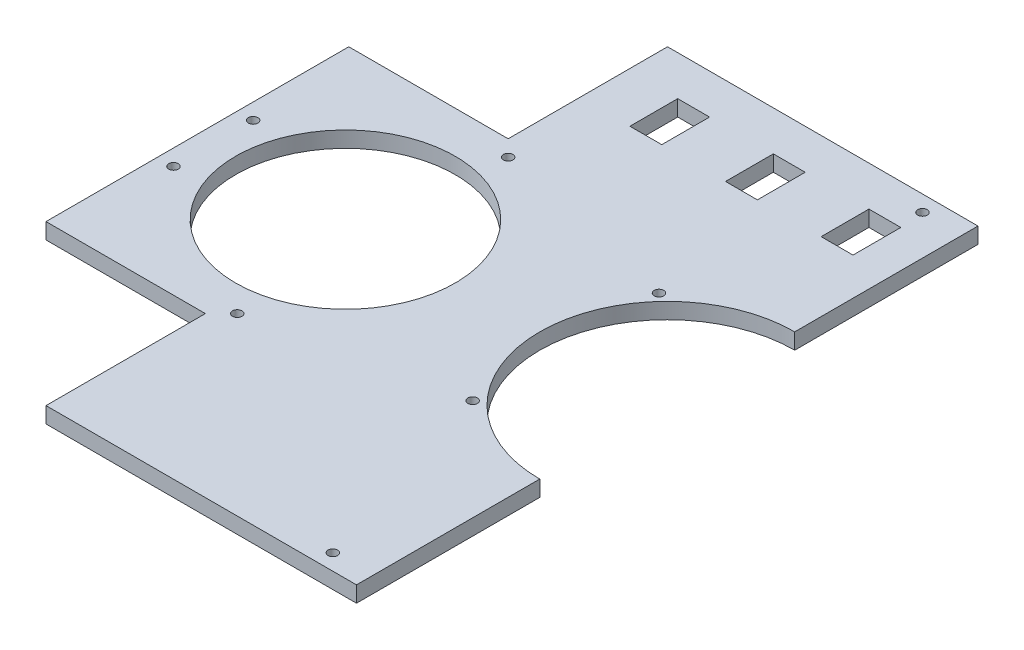
ISO-10303-21;
HEADER;
FILE_DESCRIPTION(('STEP AP214'),'2;1');
FILE_NAME('part.step','',(''),(''),'','','');
FILE_SCHEMA(('AUTOMOTIVE_DESIGN { 1 0 10303 214 1 1 1 1 }'));
ENDSEC;
DATA;
#1=APPLICATION_CONTEXT('core data for automotive mechanical design processes');
#2=APPLICATION_PROTOCOL_DEFINITION('international standard','automotive_design',2000,#1);
#3=PRODUCT_CONTEXT('',#1,'mechanical');
#4=PRODUCT('Part','Part','',(#3));
#5=PRODUCT_RELATED_PRODUCT_CATEGORY('part','',(#4));
#6=PRODUCT_DEFINITION_FORMATION('','',#4);
#7=PRODUCT_DEFINITION_CONTEXT('part definition',#1,'design');
#8=PRODUCT_DEFINITION('design','',#6,#7);
#9=PRODUCT_DEFINITION_SHAPE('','',#8);
#10=(LENGTH_UNIT() NAMED_UNIT(*) SI_UNIT(.MILLI.,.METRE.));
#11=(NAMED_UNIT(*) PLANE_ANGLE_UNIT() SI_UNIT($,.RADIAN.));
#12=(NAMED_UNIT(*) SI_UNIT($,.STERADIAN.) SOLID_ANGLE_UNIT());
#13=UNCERTAINTY_MEASURE_WITH_UNIT(LENGTH_MEASURE(1.E-05),#10,'distance_accuracy_value','');
#14=(GEOMETRIC_REPRESENTATION_CONTEXT(3) GLOBAL_UNCERTAINTY_ASSIGNED_CONTEXT((#13)) GLOBAL_UNIT_ASSIGNED_CONTEXT((#10,
#11,#12)) REPRESENTATION_CONTEXT('',''));
#15=CARTESIAN_POINT('',(0.,0.,0.));
#16=DIRECTION('',(0.,0.,1.));
#17=DIRECTION('',(1.,0.,0.));
#18=AXIS2_PLACEMENT_3D('',#15,#16,#17);
#19=CARTESIAN_POINT('',(0.,5.,0.00446078629536516));
#20=DIRECTION('',(0.,-1.,0.));
#21=DIRECTION('',(0.,0.,-1.));
#22=AXIS2_PLACEMENT_3D('',#19,#20,#21);
#23=CYLINDRICAL_SURFACE('',#22,40.);
#24=CARTESIAN_POINT('',(0.,0.,0.00446078629536516));
#25=DIRECTION('',(0.,1.,0.));
#26=DIRECTION('',(0.,0.,1.));
#27=AXIS2_PLACEMENT_3D('',#24,#25,#26);
#28=CIRCLE('',#27,40.);
#29=CARTESIAN_POINT('',(0.,0.,-39.9955392137046));
#30=VERTEX_POINT('',#29);
#31=CARTESIAN_POINT('',(0.,0.,40.0044607862954));
#32=VERTEX_POINT('',#31);
#33=EDGE_CURVE('E348',#30,#32,#28,.T.);
#34=ORIENTED_EDGE('',*,*,#33,.F.);
#35=DIRECTION('',(0.,-1.,0.));
#36=VECTOR('',#35,1.);
#37=CARTESIAN_POINT('',(0.,5.,-39.9955392137046));
#38=LINE('',#37,#36);
#39=CARTESIAN_POINT('',(0.,5.,-39.9955392137046));
#40=VERTEX_POINT('',#39);
#41=EDGE_CURVE('E11',#40,#30,#38,.T.);
#42=ORIENTED_EDGE('',*,*,#41,.F.);
#43=CARTESIAN_POINT('',(0.,5.,0.00446078629536516));
#44=DIRECTION('',(0.,1.,0.));
#45=DIRECTION('',(0.,0.,1.));
#46=AXIS2_PLACEMENT_3D('',#43,#44,#45);
#47=CIRCLE('',#46,40.);
#48=CARTESIAN_POINT('',(0.,5.,40.0044607862954));
#49=VERTEX_POINT('',#48);
#50=EDGE_CURVE('E293',#40,#49,#47,.T.);
#51=ORIENTED_EDGE('',*,*,#50,.T.);
#52=DIRECTION('',(0.,-1.,0.));
#53=VECTOR('',#52,1.);
#54=CARTESIAN_POINT('',(0.,5.,40.0044607862954));
#55=LINE('',#54,#53);
#56=EDGE_CURVE('E339',#49,#32,#55,.T.);
#57=ORIENTED_EDGE('',*,*,#56,.T.);
#58=EDGE_LOOP('',(#34,#42,#51,#57));
#59=FACE_BOUND('',#58,.T.);
#60=ADVANCED_FACE('F35',(#59),#23,.F.);
#61=CARTESIAN_POINT('',(0.,5.,0.));
#62=DIRECTION('',(1.,0.,0.));
#63=DIRECTION('',(0.,0.,-1.));
#64=AXIS2_PLACEMENT_3D('',#61,#62,#63);
#65=PLANE('',#64);
#66=DIRECTION('',(0.,0.,1.));
#67=VECTOR('',#66,1.);
#68=CARTESIAN_POINT('',(0.,0.,0.));
#69=LINE('',#68,#67);
#70=CARTESIAN_POINT('',(0.,0.,-97.4955392137046));
#71=VERTEX_POINT('',#70);
#72=EDGE_CURVE('E351',#71,#30,#69,.T.);
#73=ORIENTED_EDGE('',*,*,#72,.F.);
#74=DIRECTION('',(0.,-1.,0.));
#75=VECTOR('',#74,1.);
#76=CARTESIAN_POINT('',(0.,5.,-97.4955392137046));
#77=LINE('',#76,#75);
#78=CARTESIAN_POINT('',(0.,5.,-97.4955392137046));
#79=VERTEX_POINT('',#78);
#80=EDGE_CURVE('E43',#79,#71,#77,.T.);
#81=ORIENTED_EDGE('',*,*,#80,.F.);
#82=DIRECTION('',(0.,0.,1.));
#83=VECTOR('',#82,1.);
#84=CARTESIAN_POINT('',(0.,5.,0.));
#85=LINE('',#84,#83);
#86=EDGE_CURVE('E296',#79,#40,#85,.T.);
#87=ORIENTED_EDGE('',*,*,#86,.T.);
#88=ORIENTED_EDGE('',*,*,#41,.T.);
#89=EDGE_LOOP('',(#73,#81,#87,#88));
#90=FACE_BOUND('',#89,.T.);
#91=ADVANCED_FACE('F417',(#90),#65,.T.);
#92=CARTESIAN_POINT('',(0.,5.,-97.4955392137046));
#93=DIRECTION('',(0.,0.,-1.));
#94=DIRECTION('',(-1.,0.,0.));
#95=AXIS2_PLACEMENT_3D('',#92,#93,#94);
#96=PLANE('',#95);
#97=DIRECTION('',(1.,0.,0.));
#98=VECTOR('',#97,1.);
#99=CARTESIAN_POINT('',(0.,0.,-97.4955392137046));
#100=LINE('',#99,#98);
#101=CARTESIAN_POINT('',(-97.415,0.,-97.4955392137047));
#102=VERTEX_POINT('',#101);
#103=EDGE_CURVE('E354',#102,#71,#100,.T.);
#104=ORIENTED_EDGE('',*,*,#103,.F.);
#105=DIRECTION('',(0.,-1.,0.));
#106=VECTOR('',#105,1.);
#107=CARTESIAN_POINT('',(-97.415,5.,-97.4955392137047));
#108=LINE('',#107,#106);
#109=CARTESIAN_POINT('',(-97.415,5.,-97.4955392137047));
#110=VERTEX_POINT('',#109);
#111=EDGE_CURVE('E409',#110,#102,#108,.T.);
#112=ORIENTED_EDGE('',*,*,#111,.F.);
#113=DIRECTION('',(1.,0.,0.));
#114=VECTOR('',#113,1.);
#115=CARTESIAN_POINT('',(0.,5.,-97.4955392137046));
#116=LINE('',#115,#114);
#117=EDGE_CURVE('E299',#110,#79,#116,.T.);
#118=ORIENTED_EDGE('',*,*,#117,.T.);
#119=ORIENTED_EDGE('',*,*,#80,.T.);
#120=EDGE_LOOP('',(#104,#112,#118,#119));
#121=FACE_BOUND('',#120,.T.);
#122=ADVANCED_FACE('F413',(#121),#96,.T.);
#123=CARTESIAN_POINT('',(-97.4149999999999,5.,1.0815237594386E-13));
#124=DIRECTION('',(-1.,0.,0.));
#125=DIRECTION('',(0.,0.,1.));
#126=AXIS2_PLACEMENT_3D('',#123,#124,#125);
#127=PLANE('',#126);
#128=DIRECTION('',(0.,0.,-1.));
#129=VECTOR('',#128,1.);
#130=CARTESIAN_POINT('',(-97.4149999999999,0.,1.0815237594386E-13));
#131=LINE('',#130,#129);
#132=CARTESIAN_POINT('',(-97.415,0.,-47.4955392137047));
#133=VERTEX_POINT('',#132);
#134=EDGE_CURVE('E357',#133,#102,#131,.T.);
#135=ORIENTED_EDGE('',*,*,#134,.F.);
#136=DIRECTION('',(0.,-1.,0.));
#137=VECTOR('',#136,1.);
#138=CARTESIAN_POINT('',(-97.415,5.,-47.4955392137047));
#139=LINE('',#138,#137);
#140=CARTESIAN_POINT('',(-97.415,5.,-47.4955392137047));
#141=VERTEX_POINT('',#140);
#142=EDGE_CURVE('E407',#141,#133,#139,.T.);
#143=ORIENTED_EDGE('',*,*,#142,.F.);
#144=DIRECTION('',(0.,0.,-1.));
#145=VECTOR('',#144,1.);
#146=CARTESIAN_POINT('',(-97.4149999999999,5.,1.0815237594386E-13));
#147=LINE('',#146,#145);
#148=EDGE_CURVE('E302',#141,#110,#147,.T.);
#149=ORIENTED_EDGE('',*,*,#148,.T.);
#150=ORIENTED_EDGE('',*,*,#111,.T.);
#151=EDGE_LOOP('',(#135,#143,#149,#150));
#152=FACE_BOUND('',#151,.T.);
#153=ADVANCED_FACE('F424',(#152),#127,.T.);
#154=CARTESIAN_POINT('',(0.,5.,-47.4955392137047));
#155=DIRECTION('',(0.,0.,-1.));
#156=DIRECTION('',(-1.,0.,0.));
#157=AXIS2_PLACEMENT_3D('',#154,#155,#156);
#158=PLANE('',#157);
#159=DIRECTION('',(1.,0.,0.));
#160=VECTOR('',#159,1.);
#161=CARTESIAN_POINT('',(0.,0.,-47.4955392137047));
#162=LINE('',#161,#160);
#163=CARTESIAN_POINT('',(-147.415,0.,-47.4955392137047));
#164=VERTEX_POINT('',#163);
#165=EDGE_CURVE('E360',#164,#133,#162,.T.);
#166=ORIENTED_EDGE('',*,*,#165,.F.);
#167=DIRECTION('',(0.,-1.,0.));
#168=VECTOR('',#167,1.);
#169=CARTESIAN_POINT('',(-147.415,5.,-47.4955392137047));
#170=LINE('',#169,#168);
#171=CARTESIAN_POINT('',(-147.415,5.,-47.4955392137047));
#172=VERTEX_POINT('',#171);
#173=EDGE_CURVE('E405',#172,#164,#170,.T.);
#174=ORIENTED_EDGE('',*,*,#173,.F.);
#175=DIRECTION('',(1.,0.,0.));
#176=VECTOR('',#175,1.);
#177=CARTESIAN_POINT('',(0.,5.,-47.4955392137047));
#178=LINE('',#177,#176);
#179=EDGE_CURVE('E305',#172,#141,#178,.T.);
#180=ORIENTED_EDGE('',*,*,#179,.T.);
#181=ORIENTED_EDGE('',*,*,#142,.T.);
#182=EDGE_LOOP('',(#166,#174,#180,#181));
#183=FACE_BOUND('',#182,.T.);
#184=ADVANCED_FACE('F452',(#183),#158,.T.);
#185=CARTESIAN_POINT('',(-147.415,5.,0.));
#186=DIRECTION('',(-1.,0.,0.));
#187=DIRECTION('',(0.,0.,1.));
#188=AXIS2_PLACEMENT_3D('',#185,#186,#187);
#189=PLANE('',#188);
#190=DIRECTION('',(0.,0.,-1.));
#191=VECTOR('',#190,1.);
#192=CARTESIAN_POINT('',(-147.415,0.,0.));
#193=LINE('',#192,#191);
#194=CARTESIAN_POINT('',(-147.415,0.,47.5044607862954));
#195=VERTEX_POINT('',#194);
#196=EDGE_CURVE('E363',#195,#164,#193,.T.);
#197=ORIENTED_EDGE('',*,*,#196,.F.);
#198=DIRECTION('',(0.,-1.,0.));
#199=VECTOR('',#198,1.);
#200=CARTESIAN_POINT('',(-147.415,5.,47.5044607862954));
#201=LINE('',#200,#199);
#202=CARTESIAN_POINT('',(-147.415,5.,47.5044607862954));
#203=VERTEX_POINT('',#202);
#204=EDGE_CURVE('E403',#203,#195,#201,.T.);
#205=ORIENTED_EDGE('',*,*,#204,.F.);
#206=DIRECTION('',(0.,0.,-1.));
#207=VECTOR('',#206,1.);
#208=CARTESIAN_POINT('',(-147.415,5.,0.));
#209=LINE('',#208,#207);
#210=EDGE_CURVE('E308',#203,#172,#209,.T.);
#211=ORIENTED_EDGE('',*,*,#210,.T.);
#212=ORIENTED_EDGE('',*,*,#173,.T.);
#213=EDGE_LOOP('',(#197,#205,#211,#212));
#214=FACE_BOUND('',#213,.T.);
#215=ADVANCED_FACE('F448',(#214),#189,.T.);
#216=CARTESIAN_POINT('',(0.,5.,47.5044607862954));
#217=DIRECTION('',(0.,0.,-1.));
#218=DIRECTION('',(-1.,0.,0.));
#219=AXIS2_PLACEMENT_3D('',#216,#217,#218);
#220=PLANE('',#219);
#221=DIRECTION('',(1.,0.,0.));
#222=VECTOR('',#221,1.);
#223=CARTESIAN_POINT('',(0.,0.,47.5044607862954));
#224=LINE('',#223,#222);
#225=CARTESIAN_POINT('',(-97.415,0.,47.5044607862954));
#226=VERTEX_POINT('',#225);
#227=EDGE_CURVE('E366',#195,#226,#224,.T.);
#228=ORIENTED_EDGE('',*,*,#227,.T.);
#229=DIRECTION('',(0.,-1.,0.));
#230=VECTOR('',#229,1.);
#231=CARTESIAN_POINT('',(-97.415,5.,47.5044607862954));
#232=LINE('',#231,#230);
#233=CARTESIAN_POINT('',(-97.415,5.,47.5044607862954));
#234=VERTEX_POINT('',#233);
#235=EDGE_CURVE('E400',#234,#226,#232,.T.);
#236=ORIENTED_EDGE('',*,*,#235,.F.);
#237=DIRECTION('',(1.,0.,0.));
#238=VECTOR('',#237,1.);
#239=CARTESIAN_POINT('',(0.,5.,47.5044607862954));
#240=LINE('',#239,#238);
#241=EDGE_CURVE('E311',#203,#234,#240,.T.);
#242=ORIENTED_EDGE('',*,*,#241,.F.);
#243=ORIENTED_EDGE('',*,*,#204,.T.);
#244=EDGE_LOOP('',(#228,#236,#242,#243));
#245=FACE_BOUND('',#244,.T.);
#246=ADVANCED_FACE('F453',(#245),#220,.F.);
#247=CARTESIAN_POINT('',(-97.4150000000001,5.,0.));
#248=DIRECTION('',(1.,0.,0.));
#249=DIRECTION('',(0.,0.,-1.));
#250=AXIS2_PLACEMENT_3D('',#247,#248,#249);
#251=PLANE('',#250);
#252=DIRECTION('',(0.,0.,1.));
#253=VECTOR('',#252,1.);
#254=CARTESIAN_POINT('',(-97.4150000000001,0.,0.));
#255=LINE('',#254,#253);
#256=CARTESIAN_POINT('',(-97.415,0.,97.5044607862954));
#257=VERTEX_POINT('',#256);
#258=EDGE_CURVE('E369',#226,#257,#255,.T.);
#259=ORIENTED_EDGE('',*,*,#258,.T.);
#260=DIRECTION('',(0.,-1.,0.));
#261=VECTOR('',#260,1.);
#262=CARTESIAN_POINT('',(-97.415,5.,97.5044607862954));
#263=LINE('',#262,#261);
#264=CARTESIAN_POINT('',(-97.415,5.,97.5044607862954));
#265=VERTEX_POINT('',#264);
#266=EDGE_CURVE('E398',#265,#257,#263,.T.);
#267=ORIENTED_EDGE('',*,*,#266,.F.);
#268=DIRECTION('',(0.,0.,1.));
#269=VECTOR('',#268,1.);
#270=CARTESIAN_POINT('',(-97.4150000000001,5.,0.));
#271=LINE('',#270,#269);
#272=EDGE_CURVE('E314',#234,#265,#271,.T.);
#273=ORIENTED_EDGE('',*,*,#272,.F.);
#274=ORIENTED_EDGE('',*,*,#235,.T.);
#275=EDGE_LOOP('',(#259,#267,#273,#274));
#276=FACE_BOUND('',#275,.T.);
#277=ADVANCED_FACE('F442',(#276),#251,.F.);
#278=CARTESIAN_POINT('',(0.,5.,97.5044607862954));
#279=DIRECTION('',(0.,0.,1.));
#280=DIRECTION('',(1.,0.,0.));
#281=AXIS2_PLACEMENT_3D('',#278,#279,#280);
#282=PLANE('',#281);
#283=DIRECTION('',(-1.,0.,0.));
#284=VECTOR('',#283,1.);
#285=CARTESIAN_POINT('',(0.,0.,97.5044607862954));
#286=LINE('',#285,#284);
#287=CARTESIAN_POINT('',(0.,0.,97.5044607862954));
#288=VERTEX_POINT('',#287);
#289=EDGE_CURVE('E372',#288,#257,#286,.T.);
#290=ORIENTED_EDGE('',*,*,#289,.F.);
#291=DIRECTION('',(0.,-1.,0.));
#292=VECTOR('',#291,1.);
#293=CARTESIAN_POINT('',(0.,5.,97.5044607862954));
#294=LINE('',#293,#292);
#295=CARTESIAN_POINT('',(0.,5.,97.5044607862954));
#296=VERTEX_POINT('',#295);
#297=EDGE_CURVE('E396',#296,#288,#294,.T.);
#298=ORIENTED_EDGE('',*,*,#297,.F.);
#299=DIRECTION('',(-1.,0.,0.));
#300=VECTOR('',#299,1.);
#301=CARTESIAN_POINT('',(0.,5.,97.5044607862954));
#302=LINE('',#301,#300);
#303=EDGE_CURVE('E316',#296,#265,#302,.T.);
#304=ORIENTED_EDGE('',*,*,#303,.T.);
#305=ORIENTED_EDGE('',*,*,#266,.T.);
#306=EDGE_LOOP('',(#290,#298,#304,#305));
#307=FACE_BOUND('',#306,.T.);
#308=ADVANCED_FACE('F439',(#307),#282,.T.);
#309=CARTESIAN_POINT('',(-12.415,5.,-92.4955392137046));
#310=DIRECTION('',(0.,-1.,0.));
#311=DIRECTION('',(0.,0.,-1.));
#312=AXIS2_PLACEMENT_3D('',#309,#310,#311);
#313=CYLINDRICAL_SURFACE('',#312,1.5);
#314=CARTESIAN_POINT('',(-12.415,5.,-92.4955392137046));
#315=DIRECTION('',(0.,1.,0.));
#316=DIRECTION('',(0.,0.,1.));
#317=AXIS2_PLACEMENT_3D('',#314,#315,#316);
#318=CIRCLE('',#317,1.5);
#319=CARTESIAN_POINT('',(-12.415,5.,-90.9955392137046));
#320=VERTEX_POINT('',#319);
#321=EDGE_CURVE('E333',#320,#320,#318,.F.);
#322=ORIENTED_EDGE('',*,*,#321,.F.);
#323=EDGE_LOOP('',(#322));
#324=FACE_BOUND('',#323,.T.);
#325=CARTESIAN_POINT('',(-12.415,0.,-92.4955392137046));
#326=DIRECTION('',(0.,1.,0.));
#327=DIRECTION('',(0.,0.,1.));
#328=AXIS2_PLACEMENT_3D('',#325,#326,#327);
#329=CIRCLE('',#328,1.5);
#330=CARTESIAN_POINT('',(-12.415,0.,-90.9955392137046));
#331=VERTEX_POINT('',#330);
#332=EDGE_CURVE('E390',#331,#331,#329,.F.);
#333=ORIENTED_EDGE('',*,*,#332,.T.);
#334=EDGE_LOOP('',(#333));
#335=FACE_BOUND('',#334,.T.);
#336=ADVANCED_FACE('F505',(#324,#335),#313,.F.);
#337=CARTESIAN_POINT('',(-92.415,5.,42.5044607862954));
#338=DIRECTION('',(0.,-1.,0.));
#339=DIRECTION('',(0.,0.,-1.));
#340=AXIS2_PLACEMENT_3D('',#337,#338,#339);
#341=CYLINDRICAL_SURFACE('',#340,1.5);
#342=CARTESIAN_POINT('',(-92.415,5.,42.5044607862954));
#343=DIRECTION('',(0.,1.,0.));
#344=DIRECTION('',(0.,0.,1.));
#345=AXIS2_PLACEMENT_3D('',#342,#343,#344);
#346=CIRCLE('',#345,1.5);
#347=CARTESIAN_POINT('',(-92.415,5.,44.0044607862954));
#348=VERTEX_POINT('',#347);
#349=EDGE_CURVE('E330',#348,#348,#346,.T.);
#350=ORIENTED_EDGE('',*,*,#349,.T.);
#351=EDGE_LOOP('',(#350));
#352=FACE_BOUND('',#351,.T.);
#353=CARTESIAN_POINT('',(-92.415,0.,42.5044607862954));
#354=DIRECTION('',(0.,1.,0.));
#355=DIRECTION('',(0.,0.,1.));
#356=AXIS2_PLACEMENT_3D('',#353,#354,#355);
#357=CIRCLE('',#356,1.5);
#358=CARTESIAN_POINT('',(-92.415,0.,44.0044607862954));
#359=VERTEX_POINT('',#358);
#360=EDGE_CURVE('E387',#359,#359,#357,.T.);
#361=ORIENTED_EDGE('',*,*,#360,.F.);
#362=EDGE_LOOP('',(#361));
#363=FACE_BOUND('',#362,.T.);
#364=ADVANCED_FACE('F508',(#352,#363),#341,.F.);
#365=CARTESIAN_POINT('',(-142.415,5.,12.5044607862954));
#366=DIRECTION('',(0.,-1.,0.));
#367=DIRECTION('',(0.,0.,-1.));
#368=AXIS2_PLACEMENT_3D('',#365,#366,#367);
#369=CYLINDRICAL_SURFACE('',#368,1.5);
#370=CARTESIAN_POINT('',(-142.415,5.,12.5044607862954));
#371=DIRECTION('',(0.,1.,0.));
#372=DIRECTION('',(0.,0.,1.));
#373=AXIS2_PLACEMENT_3D('',#370,#371,#372);
#374=CIRCLE('',#373,1.5);
#375=CARTESIAN_POINT('',(-142.415,5.,14.0044607862954));
#376=VERTEX_POINT('',#375);
#377=EDGE_CURVE('E327',#376,#376,#374,.T.);
#378=ORIENTED_EDGE('',*,*,#377,.T.);
#379=EDGE_LOOP('',(#378));
#380=FACE_BOUND('',#379,.T.);
#381=CARTESIAN_POINT('',(-142.415,0.,12.5044607862954));
#382=DIRECTION('',(0.,1.,0.));
#383=DIRECTION('',(0.,0.,1.));
#384=AXIS2_PLACEMENT_3D('',#381,#382,#383);
#385=CIRCLE('',#384,1.5);
#386=CARTESIAN_POINT('',(-142.415,0.,14.0044607862954));
#387=VERTEX_POINT('',#386);
#388=EDGE_CURVE('E384',#387,#387,#385,.T.);
#389=ORIENTED_EDGE('',*,*,#388,.F.);
#390=EDGE_LOOP('',(#389));
#391=FACE_BOUND('',#390,.T.);
#392=ADVANCED_FACE('F512',(#380,#391),#369,.F.);
#393=CARTESIAN_POINT('',(-12.415,5.,92.5044607862954));
#394=DIRECTION('',(0.,-1.,0.));
#395=DIRECTION('',(0.,0.,-1.));
#396=AXIS2_PLACEMENT_3D('',#393,#394,#395);
#397=CYLINDRICAL_SURFACE('',#396,1.5);
#398=CARTESIAN_POINT('',(-12.415,5.,92.5044607862954));
#399=DIRECTION('',(0.,1.,0.));
#400=DIRECTION('',(0.,0.,1.));
#401=AXIS2_PLACEMENT_3D('',#398,#399,#400);
#402=CIRCLE('',#401,1.5);
#403=CARTESIAN_POINT('',(-12.415,5.,94.0044607862954));
#404=VERTEX_POINT('',#403);
#405=EDGE_CURVE('E324',#404,#404,#402,.T.);
#406=ORIENTED_EDGE('',*,*,#405,.T.);
#407=EDGE_LOOP('',(#406));
#408=FACE_BOUND('',#407,.T.);
#409=CARTESIAN_POINT('',(-12.415,0.,92.5044607862954));
#410=DIRECTION('',(0.,1.,0.));
#411=DIRECTION('',(0.,0.,1.));
#412=AXIS2_PLACEMENT_3D('',#409,#410,#411);
#413=CIRCLE('',#412,1.5);
#414=CARTESIAN_POINT('',(-12.415,0.,94.0044607862954));
#415=VERTEX_POINT('',#414);
#416=EDGE_CURVE('E381',#415,#415,#413,.T.);
#417=ORIENTED_EDGE('',*,*,#416,.F.);
#418=EDGE_LOOP('',(#417));
#419=FACE_BOUND('',#418,.T.);
#420=ADVANCED_FACE('F516',(#408,#419),#397,.F.);
#421=CARTESIAN_POINT('',(-31.8198051533946,5.,29.2348051533946));
#422=DIRECTION('',(0.,-1.,0.));
#423=DIRECTION('',(0.,0.,-1.));
#424=AXIS2_PLACEMENT_3D('',#421,#422,#423);
#425=CYLINDRICAL_SURFACE('',#424,1.49999999999998);
#426=CARTESIAN_POINT('',(-31.8198051533946,5.,29.2348051533946));
#427=DIRECTION('',(0.,1.,0.));
#428=DIRECTION('',(0.,0.,1.));
#429=AXIS2_PLACEMENT_3D('',#426,#427,#428);
#430=CIRCLE('',#429,1.49999999999998);
#431=CARTESIAN_POINT('',(-31.8198051533946,5.,30.7348051533946));
#432=VERTEX_POINT('',#431);
#433=EDGE_CURVE('E321',#432,#432,#430,.T.);
#434=ORIENTED_EDGE('',*,*,#433,.T.);
#435=EDGE_LOOP('',(#434));
#436=FACE_BOUND('',#435,.T.);
#437=CARTESIAN_POINT('',(-31.8198051533946,0.,29.2348051533946));
#438=DIRECTION('',(0.,1.,0.));
#439=DIRECTION('',(0.,0.,1.));
#440=AXIS2_PLACEMENT_3D('',#437,#438,#439);
#441=CIRCLE('',#440,1.49999999999998);
#442=CARTESIAN_POINT('',(-31.8198051533946,0.,30.7348051533946));
#443=VERTEX_POINT('',#442);
#444=EDGE_CURVE('E378',#443,#443,#441,.T.);
#445=ORIENTED_EDGE('',*,*,#444,.F.);
#446=EDGE_LOOP('',(#445));
#447=FACE_BOUND('',#446,.T.);
#448=ADVANCED_FACE('F520',(#436,#447),#425,.F.);
#449=CARTESIAN_POINT('',(0.,5.,0.));
#450=DIRECTION('',(-1.,0.,0.));
#451=DIRECTION('',(0.,0.,1.));
#452=AXIS2_PLACEMENT_3D('',#449,#450,#451);
#453=PLANE('',#452);
#454=DIRECTION('',(0.,0.,-1.));
#455=VECTOR('',#454,1.);
#456=CARTESIAN_POINT('',(0.,0.,0.));
#457=LINE('',#456,#455);
#458=EDGE_CURVE('E375',#288,#32,#457,.T.);
#459=ORIENTED_EDGE('',*,*,#458,.T.);
#460=ORIENTED_EDGE('',*,*,#56,.F.);
#461=DIRECTION('',(0.,0.,-1.));
#462=VECTOR('',#461,1.);
#463=CARTESIAN_POINT('',(0.,5.,0.));
#464=LINE('',#463,#462);
#465=EDGE_CURVE('E319',#296,#49,#464,.T.);
#466=ORIENTED_EDGE('',*,*,#465,.F.);
#467=ORIENTED_EDGE('',*,*,#297,.T.);
#468=EDGE_LOOP('',(#459,#460,#466,#467));
#469=FACE_BOUND('',#468,.T.);
#470=ADVANCED_FACE('F473',(#469),#453,.F.);
#471=CARTESIAN_POINT('',(-31.8198051533946,5.,-29.2258835808039));
#472=DIRECTION('',(0.,-1.,0.));
#473=DIRECTION('',(0.,0.,-1.));
#474=AXIS2_PLACEMENT_3D('',#471,#472,#473);
#475=CYLINDRICAL_SURFACE('',#474,1.49999999999998);
#476=CARTESIAN_POINT('',(-31.8198051533946,5.,-29.2258835808039));
#477=DIRECTION('',(0.,1.,0.));
#478=DIRECTION('',(0.,0.,1.));
#479=AXIS2_PLACEMENT_3D('',#476,#477,#478);
#480=CIRCLE('',#479,1.49999999999998);
#481=CARTESIAN_POINT('',(-31.8198051533946,5.,-27.7258835808039));
#482=VERTEX_POINT('',#481);
#483=EDGE_CURVE('E290',#482,#482,#480,.F.);
#484=ORIENTED_EDGE('',*,*,#483,.F.);
#485=EDGE_LOOP('',(#484));
#486=FACE_BOUND('',#485,.T.);
#487=CARTESIAN_POINT('',(-31.8198051533946,0.,-29.2258835808039));
#488=DIRECTION('',(0.,1.,0.));
#489=DIRECTION('',(0.,0.,1.));
#490=AXIS2_PLACEMENT_3D('',#487,#488,#489);
#491=CIRCLE('',#490,1.49999999999998);
#492=CARTESIAN_POINT('',(-31.8198051533946,0.,-27.7258835808039));
#493=VERTEX_POINT('',#492);
#494=EDGE_CURVE('E345',#493,#493,#491,.F.);
#495=ORIENTED_EDGE('',*,*,#494,.T.);
#496=EDGE_LOOP('',(#495));
#497=FACE_BOUND('',#496,.T.);
#498=ADVANCED_FACE('F470',(#486,#497),#475,.F.);
#499=CARTESIAN_POINT('',(-142.415,5.,-12.4955392137047));
#500=DIRECTION('',(0.,-1.,0.));
#501=DIRECTION('',(0.,0.,-1.));
#502=AXIS2_PLACEMENT_3D('',#499,#500,#501);
#503=CYLINDRICAL_SURFACE('',#502,1.5);
#504=CARTESIAN_POINT('',(-142.415,5.,-12.4955392137047));
#505=DIRECTION('',(0.,1.,0.));
#506=DIRECTION('',(0.,0.,1.));
#507=AXIS2_PLACEMENT_3D('',#504,#505,#506);
#508=CIRCLE('',#507,1.5);
#509=CARTESIAN_POINT('',(-142.415,5.,-10.9955392137047));
#510=VERTEX_POINT('',#509);
#511=EDGE_CURVE('E286',#510,#510,#508,.F.);
#512=ORIENTED_EDGE('',*,*,#511,.F.);
#513=EDGE_LOOP('',(#512));
#514=FACE_BOUND('',#513,.T.);
#515=CARTESIAN_POINT('',(-142.415,0.,-12.4955392137047));
#516=DIRECTION('',(0.,1.,0.));
#517=DIRECTION('',(0.,0.,1.));
#518=AXIS2_PLACEMENT_3D('',#515,#516,#517);
#519=CIRCLE('',#518,1.5);
#520=CARTESIAN_POINT('',(-142.415,0.,-10.9955392137047));
#521=VERTEX_POINT('',#520);
#522=EDGE_CURVE('E342',#521,#521,#519,.F.);
#523=ORIENTED_EDGE('',*,*,#522,.T.);
#524=EDGE_LOOP('',(#523));
#525=FACE_BOUND('',#524,.T.);
#526=ADVANCED_FACE('F472',(#514,#525),#503,.F.);
#527=CARTESIAN_POINT('',(-100.973221988036,5.,0.00446078629536516));
#528=DIRECTION('',(0.,-1.,0.));
#529=DIRECTION('',(0.,0.,-1.));
#530=AXIS2_PLACEMENT_3D('',#527,#528,#529);
#531=CYLINDRICAL_SURFACE('',#530,34.4618877002079);
#532=CARTESIAN_POINT('',(-100.973221988036,5.,0.00446078629536516));
#533=DIRECTION('',(0.,1.,0.));
#534=DIRECTION('',(0.,0.,1.));
#535=AXIS2_PLACEMENT_3D('',#532,#533,#534);
#536=CIRCLE('',#535,34.4618877002079);
#537=CARTESIAN_POINT('',(-100.973221988036,5.,34.4663484865033));
#538=VERTEX_POINT('',#537);
#539=EDGE_CURVE('E283',#538,#538,#536,.T.);
#540=ORIENTED_EDGE('',*,*,#539,.T.);
#541=EDGE_LOOP('',(#540));
#542=FACE_BOUND('',#541,.T.);
#543=CARTESIAN_POINT('',(-100.973221988036,0.,0.00446078629536516));
#544=DIRECTION('',(0.,1.,0.));
#545=DIRECTION('',(0.,0.,1.));
#546=AXIS2_PLACEMENT_3D('',#543,#544,#545);
#547=CIRCLE('',#546,34.4618877002079);
#548=CARTESIAN_POINT('',(-100.973221988036,0.,34.4663484865033));
#549=VERTEX_POINT('',#548);
#550=EDGE_CURVE('E199',#549,#549,#547,.T.);
#551=ORIENTED_EDGE('',*,*,#550,.F.);
#552=EDGE_LOOP('',(#551));
#553=FACE_BOUND('',#552,.T.);
#554=ADVANCED_FACE('F37',(#542,#553),#531,.F.);
#555=CARTESIAN_POINT('',(-92.415,5.,-42.4955392137047));
#556=DIRECTION('',(0.,-1.,0.));
#557=DIRECTION('',(0.,0.,-1.));
#558=AXIS2_PLACEMENT_3D('',#555,#556,#557);
#559=CYLINDRICAL_SURFACE('',#558,1.5);
#560=CARTESIAN_POINT('',(-92.415,5.,-42.4955392137047));
#561=DIRECTION('',(0.,1.,0.));
#562=DIRECTION('',(0.,0.,1.));
#563=AXIS2_PLACEMENT_3D('',#560,#561,#562);
#564=CIRCLE('',#563,1.5);
#565=CARTESIAN_POINT('',(-92.415,5.,-40.9955392137047));
#566=VERTEX_POINT('',#565);
#567=EDGE_CURVE('E336',#566,#566,#564,.F.);
#568=ORIENTED_EDGE('',*,*,#567,.F.);
#569=EDGE_LOOP('',(#568));
#570=FACE_BOUND('',#569,.T.);
#571=CARTESIAN_POINT('',(-92.415,0.,-42.4955392137047));
#572=DIRECTION('',(0.,1.,0.));
#573=DIRECTION('',(0.,0.,1.));
#574=AXIS2_PLACEMENT_3D('',#571,#572,#573);
#575=CIRCLE('',#574,1.5);
#576=CARTESIAN_POINT('',(-92.415,0.,-40.9955392137047));
#577=VERTEX_POINT('',#576);
#578=EDGE_CURVE('E287',#577,#577,#575,.F.);
#579=ORIENTED_EDGE('',*,*,#578,.T.);
#580=EDGE_LOOP('',(#579));
#581=FACE_BOUND('',#580,.T.);
#582=ADVANCED_FACE('F480',(#570,#581),#559,.F.);
#583=CARTESIAN_POINT('',(0.,5.,0.));
#584=DIRECTION('',(0.,1.,0.));
#585=DIRECTION('',(0.,0.,1.));
#586=AXIS2_PLACEMENT_3D('',#583,#584,#585);
#587=PLANE('',#586);
#588=DIRECTION('',(0.,0.,-1.));
#589=VECTOR('',#588,1.);
#590=CARTESIAN_POINT('',(-71.7151478825739,5.,-84.9955392137047));
#591=LINE('',#590,#589);
#592=CARTESIAN_POINT('',(-71.7151478825739,5.,-69.9955392137047));
#593=VERTEX_POINT('',#592);
#594=CARTESIAN_POINT('',(-71.7151478825739,5.,-84.9955392137047));
#595=VERTEX_POINT('',#594);
#596=EDGE_CURVE('E50',#593,#595,#591,.T.);
#597=ORIENTED_EDGE('',*,*,#596,.F.);
#598=DIRECTION('',(1.,0.,0.));
#599=VECTOR('',#598,1.);
#600=CARTESIAN_POINT('',(-81.7151478825739,5.,-69.9955392137047));
#601=LINE('',#600,#599);
#602=CARTESIAN_POINT('',(-81.7151478825739,5.,-69.9955392137047));
#603=VERTEX_POINT('',#602);
#604=EDGE_CURVE('E191',#603,#593,#601,.T.);
#605=ORIENTED_EDGE('',*,*,#604,.F.);
#606=DIRECTION('',(0.,0.,1.));
#607=VECTOR('',#606,1.);
#608=CARTESIAN_POINT('',(-81.7151478825739,5.,-84.9955392137047));
#609=LINE('',#608,#607);
#610=CARTESIAN_POINT('',(-81.7151478825739,5.,-84.9955392137047));
#611=VERTEX_POINT('',#610);
#612=EDGE_CURVE('E214',#611,#603,#609,.T.);
#613=ORIENTED_EDGE('',*,*,#612,.F.);
#614=DIRECTION('',(-1.,0.,0.));
#615=VECTOR('',#614,1.);
#616=CARTESIAN_POINT('',(-81.7151478825739,5.,-84.9955392137047));
#617=LINE('',#616,#615);
#618=EDGE_CURVE('E207',#595,#611,#617,.T.);
#619=ORIENTED_EDGE('',*,*,#618,.F.);
#620=EDGE_LOOP('',(#597,#605,#613,#619));
#621=FACE_BOUND('',#620,.T.);
#622=DIRECTION('',(1.,0.,0.));
#623=VECTOR('',#622,1.);
#624=CARTESIAN_POINT('',(-51.7151478825739,5.,-69.9955392137047));
#625=LINE('',#624,#623);
#626=CARTESIAN_POINT('',(-51.7151478825739,5.,-69.9955392137047));
#627=VERTEX_POINT('',#626);
#628=CARTESIAN_POINT('',(-41.7151478825739,5.,-69.9955392137047));
#629=VERTEX_POINT('',#628);
#630=EDGE_CURVE('E58',#627,#629,#625,.T.);
#631=ORIENTED_EDGE('',*,*,#630,.F.);
#632=DIRECTION('',(0.,0.,1.));
#633=VECTOR('',#632,1.);
#634=CARTESIAN_POINT('',(-51.7151478825739,5.,-84.9955392137047));
#635=LINE('',#634,#633);
#636=CARTESIAN_POINT('',(-51.7151478825739,5.,-84.9955392137047));
#637=VERTEX_POINT('',#636);
#638=EDGE_CURVE('E239',#637,#627,#635,.T.);
#639=ORIENTED_EDGE('',*,*,#638,.F.);
#640=DIRECTION('',(-1.,0.,0.));
#641=VECTOR('',#640,1.);
#642=CARTESIAN_POINT('',(-51.7151478825739,5.,-84.9955392137047));
#643=LINE('',#642,#641);
#644=CARTESIAN_POINT('',(-41.7151478825739,5.,-84.9955392137047));
#645=VERTEX_POINT('',#644);
#646=EDGE_CURVE('E236',#645,#637,#643,.T.);
#647=ORIENTED_EDGE('',*,*,#646,.F.);
#648=DIRECTION('',(0.,0.,-1.));
#649=VECTOR('',#648,1.);
#650=CARTESIAN_POINT('',(-41.7151478825739,5.,-84.9955392137047));
#651=LINE('',#650,#649);
#652=EDGE_CURVE('E233',#629,#645,#651,.T.);
#653=ORIENTED_EDGE('',*,*,#652,.F.);
#654=EDGE_LOOP('',(#631,#639,#647,#653));
#655=FACE_BOUND('',#654,.T.);
#656=DIRECTION('',(1.,0.,0.));
#657=VECTOR('',#656,1.);
#658=CARTESIAN_POINT('',(-21.7151478825739,5.,-69.9955392137047));
#659=LINE('',#658,#657);
#660=CARTESIAN_POINT('',(-21.7151478825739,5.,-69.9955392137047));
#661=VERTEX_POINT('',#660);
#662=CARTESIAN_POINT('',(-11.7151478825739,5.,-69.9955392137047));
#663=VERTEX_POINT('',#662);
#664=EDGE_CURVE('E261',#661,#663,#659,.T.);
#665=ORIENTED_EDGE('',*,*,#664,.F.);
#666=DIRECTION('',(0.,0.,1.));
#667=VECTOR('',#666,1.);
#668=CARTESIAN_POINT('',(-21.7151478825739,5.,-84.9955392137047));
#669=LINE('',#668,#667);
#670=CARTESIAN_POINT('',(-21.7151478825739,5.,-84.9955392137047));
#671=VERTEX_POINT('',#670);
#672=EDGE_CURVE('E269',#671,#661,#669,.T.);
#673=ORIENTED_EDGE('',*,*,#672,.F.);
#674=DIRECTION('',(-1.,0.,0.));
#675=VECTOR('',#674,1.);
#676=CARTESIAN_POINT('',(-21.7151478825739,5.,-84.9955392137047));
#677=LINE('',#676,#675);
#678=CARTESIAN_POINT('',(-11.7151478825739,5.,-84.9955392137047));
#679=VERTEX_POINT('',#678);
#680=EDGE_CURVE('E266',#679,#671,#677,.T.);
#681=ORIENTED_EDGE('',*,*,#680,.F.);
#682=DIRECTION('',(0.,0.,-1.));
#683=VECTOR('',#682,1.);
#684=CARTESIAN_POINT('',(-11.7151478825739,5.,-84.9955392137047));
#685=LINE('',#684,#683);
#686=EDGE_CURVE('E263',#663,#679,#685,.T.);
#687=ORIENTED_EDGE('',*,*,#686,.F.);
#688=EDGE_LOOP('',(#665,#673,#681,#687));
#689=FACE_BOUND('',#688,.T.);
#690=ORIENTED_EDGE('',*,*,#539,.F.);
#691=EDGE_LOOP('',(#690));
#692=FACE_BOUND('',#691,.T.);
#693=ORIENTED_EDGE('',*,*,#511,.T.);
#694=EDGE_LOOP('',(#693));
#695=FACE_BOUND('',#694,.T.);
#696=ORIENTED_EDGE('',*,*,#483,.T.);
#697=EDGE_LOOP('',(#696));
#698=FACE_BOUND('',#697,.T.);
#699=ORIENTED_EDGE('',*,*,#50,.F.);
#700=ORIENTED_EDGE('',*,*,#86,.F.);
#701=ORIENTED_EDGE('',*,*,#117,.F.);
#702=ORIENTED_EDGE('',*,*,#148,.F.);
#703=ORIENTED_EDGE('',*,*,#179,.F.);
#704=ORIENTED_EDGE('',*,*,#210,.F.);
#705=ORIENTED_EDGE('',*,*,#241,.T.);
#706=ORIENTED_EDGE('',*,*,#272,.T.);
#707=ORIENTED_EDGE('',*,*,#303,.F.);
#708=ORIENTED_EDGE('',*,*,#465,.T.);
#709=EDGE_LOOP('',(#699,#700,#701,#702,#703,#704,#705,#706,#707,#708));
#710=FACE_BOUND('',#709,.T.);
#711=ORIENTED_EDGE('',*,*,#433,.F.);
#712=EDGE_LOOP('',(#711));
#713=FACE_BOUND('',#712,.T.);
#714=ORIENTED_EDGE('',*,*,#405,.F.);
#715=EDGE_LOOP('',(#714));
#716=FACE_BOUND('',#715,.T.);
#717=ORIENTED_EDGE('',*,*,#377,.F.);
#718=EDGE_LOOP('',(#717));
#719=FACE_BOUND('',#718,.T.);
#720=ORIENTED_EDGE('',*,*,#349,.F.);
#721=EDGE_LOOP('',(#720));
#722=FACE_BOUND('',#721,.T.);
#723=ORIENTED_EDGE('',*,*,#321,.T.);
#724=EDGE_LOOP('',(#723));
#725=FACE_BOUND('',#724,.T.);
#726=ORIENTED_EDGE('',*,*,#567,.T.);
#727=EDGE_LOOP('',(#726));
#728=FACE_BOUND('',#727,.T.);
#729=ADVANCED_FACE('F428',(#621,#655,#689,#692,#695,#698,#710,#713,#716,#719,#722,#725,#728),
#587,.T.);
#730=CARTESIAN_POINT('',(0.,0.,0.));
#731=DIRECTION('',(0.,1.,0.));
#732=DIRECTION('',(0.,0.,1.));
#733=AXIS2_PLACEMENT_3D('',#730,#731,#732);
#734=PLANE('',#733);
#735=DIRECTION('',(-1.,0.,0.));
#736=VECTOR('',#735,1.);
#737=CARTESIAN_POINT('',(-81.7151478825739,0.,-69.9955392137047));
#738=LINE('',#737,#736);
#739=CARTESIAN_POINT('',(-71.7151478825739,0.,-69.9955392137047));
#740=VERTEX_POINT('',#739);
#741=CARTESIAN_POINT('',(-81.7151478825739,0.,-69.9955392137047));
#742=VERTEX_POINT('',#741);
#743=EDGE_CURVE('E205',#740,#742,#738,.T.);
#744=ORIENTED_EDGE('',*,*,#743,.F.);
#745=DIRECTION('',(0.,0.,1.));
#746=VECTOR('',#745,1.);
#747=CARTESIAN_POINT('',(-71.7151478825739,0.,-84.9955392137047));
#748=LINE('',#747,#746);
#749=CARTESIAN_POINT('',(-71.7151478825739,0.,-84.9955392137047));
#750=VERTEX_POINT('',#749);
#751=EDGE_CURVE('E185',#750,#740,#748,.T.);
#752=ORIENTED_EDGE('',*,*,#751,.F.);
#753=DIRECTION('',(1.,0.,0.));
#754=VECTOR('',#753,1.);
#755=CARTESIAN_POINT('',(-81.7151478825739,0.,-84.9955392137047));
#756=LINE('',#755,#754);
#757=CARTESIAN_POINT('',(-81.7151478825739,0.,-84.9955392137047));
#758=VERTEX_POINT('',#757);
#759=EDGE_CURVE('E195',#758,#750,#756,.T.);
#760=ORIENTED_EDGE('',*,*,#759,.F.);
#761=DIRECTION('',(0.,0.,-1.));
#762=VECTOR('',#761,1.);
#763=CARTESIAN_POINT('',(-81.7151478825739,0.,-84.9955392137047));
#764=LINE('',#763,#762);
#765=EDGE_CURVE('E209',#742,#758,#764,.T.);
#766=ORIENTED_EDGE('',*,*,#765,.F.);
#767=EDGE_LOOP('',(#744,#752,#760,#766));
#768=FACE_BOUND('',#767,.T.);
#769=DIRECTION('',(0.,0.,-1.));
#770=VECTOR('',#769,1.);
#771=CARTESIAN_POINT('',(-51.7151478825739,0.,-84.9955392137047));
#772=LINE('',#771,#770);
#773=CARTESIAN_POINT('',(-51.7151478825739,0.,-69.9955392137047));
#774=VERTEX_POINT('',#773);
#775=CARTESIAN_POINT('',(-51.7151478825739,0.,-84.9955392137047));
#776=VERTEX_POINT('',#775);
#777=EDGE_CURVE('E225',#774,#776,#772,.T.);
#778=ORIENTED_EDGE('',*,*,#777,.F.);
#779=DIRECTION('',(-1.,0.,0.));
#780=VECTOR('',#779,1.);
#781=CARTESIAN_POINT('',(-51.7151478825739,0.,-69.9955392137047));
#782=LINE('',#781,#780);
#783=CARTESIAN_POINT('',(-41.7151478825739,0.,-69.9955392137047));
#784=VERTEX_POINT('',#783);
#785=EDGE_CURVE('E229',#784,#774,#782,.T.);
#786=ORIENTED_EDGE('',*,*,#785,.F.);
#787=DIRECTION('',(0.,0.,1.));
#788=VECTOR('',#787,1.);
#789=CARTESIAN_POINT('',(-41.7151478825739,0.,-84.9955392137047));
#790=LINE('',#789,#788);
#791=CARTESIAN_POINT('',(-41.7151478825739,0.,-84.9955392137047));
#792=VERTEX_POINT('',#791);
#793=EDGE_CURVE('E245',#792,#784,#790,.T.);
#794=ORIENTED_EDGE('',*,*,#793,.F.);
#795=DIRECTION('',(1.,0.,0.));
#796=VECTOR('',#795,1.);
#797=CARTESIAN_POINT('',(-51.7151478825739,0.,-84.9955392137047));
#798=LINE('',#797,#796);
#799=EDGE_CURVE('E223',#776,#792,#798,.T.);
#800=ORIENTED_EDGE('',*,*,#799,.F.);
#801=EDGE_LOOP('',(#778,#786,#794,#800));
#802=FACE_BOUND('',#801,.T.);
#803=DIRECTION('',(0.,0.,-1.));
#804=VECTOR('',#803,1.);
#805=CARTESIAN_POINT('',(-21.7151478825739,0.,-84.9955392137047));
#806=LINE('',#805,#804);
#807=CARTESIAN_POINT('',(-21.7151478825739,0.,-69.9955392137047));
#808=VERTEX_POINT('',#807);
#809=CARTESIAN_POINT('',(-21.7151478825739,0.,-84.9955392137047));
#810=VERTEX_POINT('',#809);
#811=EDGE_CURVE('E255',#808,#810,#806,.T.);
#812=ORIENTED_EDGE('',*,*,#811,.F.);
#813=DIRECTION('',(-1.,0.,0.));
#814=VECTOR('',#813,1.);
#815=CARTESIAN_POINT('',(-21.7151478825739,0.,-69.9955392137047));
#816=LINE('',#815,#814);
#817=CARTESIAN_POINT('',(-11.7151478825739,0.,-69.9955392137047));
#818=VERTEX_POINT('',#817);
#819=EDGE_CURVE('E258',#818,#808,#816,.T.);
#820=ORIENTED_EDGE('',*,*,#819,.F.);
#821=DIRECTION('',(0.,0.,1.));
#822=VECTOR('',#821,1.);
#823=CARTESIAN_POINT('',(-11.7151478825739,0.,-84.9955392137047));
#824=LINE('',#823,#822);
#825=CARTESIAN_POINT('',(-11.7151478825739,0.,-84.9955392137047));
#826=VERTEX_POINT('',#825);
#827=EDGE_CURVE('E226',#826,#818,#824,.T.);
#828=ORIENTED_EDGE('',*,*,#827,.F.);
#829=DIRECTION('',(1.,0.,0.));
#830=VECTOR('',#829,1.);
#831=CARTESIAN_POINT('',(-21.7151478825739,0.,-84.9955392137047));
#832=LINE('',#831,#830);
#833=EDGE_CURVE('E253',#810,#826,#832,.T.);
#834=ORIENTED_EDGE('',*,*,#833,.F.);
#835=EDGE_LOOP('',(#812,#820,#828,#834));
#836=FACE_BOUND('',#835,.T.);
#837=ORIENTED_EDGE('',*,*,#550,.T.);
#838=EDGE_LOOP('',(#837));
#839=FACE_BOUND('',#838,.T.);
#840=ORIENTED_EDGE('',*,*,#522,.F.);
#841=EDGE_LOOP('',(#840));
#842=FACE_BOUND('',#841,.T.);
#843=ORIENTED_EDGE('',*,*,#494,.F.);
#844=EDGE_LOOP('',(#843));
#845=FACE_BOUND('',#844,.T.);
#846=ORIENTED_EDGE('',*,*,#33,.T.);
#847=ORIENTED_EDGE('',*,*,#458,.F.);
#848=ORIENTED_EDGE('',*,*,#289,.T.);
#849=ORIENTED_EDGE('',*,*,#258,.F.);
#850=ORIENTED_EDGE('',*,*,#227,.F.);
#851=ORIENTED_EDGE('',*,*,#196,.T.);
#852=ORIENTED_EDGE('',*,*,#165,.T.);
#853=ORIENTED_EDGE('',*,*,#134,.T.);
#854=ORIENTED_EDGE('',*,*,#103,.T.);
#855=ORIENTED_EDGE('',*,*,#72,.T.);
#856=EDGE_LOOP('',(#846,#847,#848,#849,#850,#851,#852,#853,#854,#855));
#857=FACE_BOUND('',#856,.T.);
#858=ORIENTED_EDGE('',*,*,#444,.T.);
#859=EDGE_LOOP('',(#858));
#860=FACE_BOUND('',#859,.T.);
#861=ORIENTED_EDGE('',*,*,#416,.T.);
#862=EDGE_LOOP('',(#861));
#863=FACE_BOUND('',#862,.T.);
#864=ORIENTED_EDGE('',*,*,#388,.T.);
#865=EDGE_LOOP('',(#864));
#866=FACE_BOUND('',#865,.T.);
#867=ORIENTED_EDGE('',*,*,#360,.T.);
#868=EDGE_LOOP('',(#867));
#869=FACE_BOUND('',#868,.T.);
#870=ORIENTED_EDGE('',*,*,#332,.F.);
#871=EDGE_LOOP('',(#870));
#872=FACE_BOUND('',#871,.T.);
#873=ORIENTED_EDGE('',*,*,#578,.F.);
#874=EDGE_LOOP('',(#873));
#875=FACE_BOUND('',#874,.T.);
#876=ADVANCED_FACE('F202',(#768,#802,#836,#839,#842,#845,#857,#860,#863,#866,#869,#872,#875),
#734,.F.);
#877=CARTESIAN_POINT('',(-21.7151478825739,-0.00100000000000013,-69.9955392137047));
#878=DIRECTION('',(0.,0.,1.));
#879=DIRECTION('',(1.,0.,0.));
#880=AXIS2_PLACEMENT_3D('',#877,#878,#879);
#881=PLANE('',#880);
#882=ORIENTED_EDGE('',*,*,#819,.T.);
#883=DIRECTION('',(0.,1.,0.));
#884=VECTOR('',#883,1.);
#885=CARTESIAN_POINT('',(-21.7151478825739,-0.00100000000000013,-69.9955392137047));
#886=LINE('',#885,#884);
#887=EDGE_CURVE('E273',#808,#661,#886,.T.);
#888=ORIENTED_EDGE('',*,*,#887,.T.);
#889=ORIENTED_EDGE('',*,*,#664,.T.);
#890=DIRECTION('',(0.,1.,0.));
#891=VECTOR('',#890,1.);
#892=CARTESIAN_POINT('',(-11.7151478825739,-0.00100000000000013,-69.9955392137047));
#893=LINE('',#892,#891);
#894=EDGE_CURVE('E272',#818,#663,#893,.T.);
#895=ORIENTED_EDGE('',*,*,#894,.F.);
#896=EDGE_LOOP('',(#882,#888,#889,#895));
#897=FACE_BOUND('',#896,.T.);
#898=ADVANCED_FACE('F488',(#897),#881,.F.);
#899=CARTESIAN_POINT('',(-21.7151478825739,-0.00100000000000013,-84.9955392137047));
#900=DIRECTION('',(-1.,0.,0.));
#901=DIRECTION('',(0.,0.,1.));
#902=AXIS2_PLACEMENT_3D('',#899,#900,#901);
#903=PLANE('',#902);
#904=ORIENTED_EDGE('',*,*,#811,.T.);
#905=DIRECTION('',(0.,1.,0.));
#906=VECTOR('',#905,1.);
#907=CARTESIAN_POINT('',(-21.7151478825739,-0.00100000000000013,-84.9955392137047));
#908=LINE('',#907,#906);
#909=EDGE_CURVE('E275',#810,#671,#908,.T.);
#910=ORIENTED_EDGE('',*,*,#909,.T.);
#911=ORIENTED_EDGE('',*,*,#672,.T.);
#912=ORIENTED_EDGE('',*,*,#887,.F.);
#913=EDGE_LOOP('',(#904,#910,#911,#912));
#914=FACE_BOUND('',#913,.T.);
#915=ADVANCED_FACE('F496',(#914),#903,.F.);
#916=CARTESIAN_POINT('',(-21.7151478825739,-0.00100000000000013,-84.9955392137047));
#917=DIRECTION('',(0.,0.,-1.));
#918=DIRECTION('',(-1.,0.,0.));
#919=AXIS2_PLACEMENT_3D('',#916,#917,#918);
#920=PLANE('',#919);
#921=ORIENTED_EDGE('',*,*,#833,.T.);
#922=DIRECTION('',(0.,1.,0.));
#923=VECTOR('',#922,1.);
#924=CARTESIAN_POINT('',(-11.7151478825739,-0.00100000000000013,-84.9955392137047));
#925=LINE('',#924,#923);
#926=EDGE_CURVE('E277',#826,#679,#925,.T.);
#927=ORIENTED_EDGE('',*,*,#926,.T.);
#928=ORIENTED_EDGE('',*,*,#680,.T.);
#929=ORIENTED_EDGE('',*,*,#909,.F.);
#930=EDGE_LOOP('',(#921,#927,#928,#929));
#931=FACE_BOUND('',#930,.T.);
#932=ADVANCED_FACE('F601',(#931),#920,.F.);
#933=CARTESIAN_POINT('',(-11.7151478825739,-0.00100000000000013,-84.9955392137047));
#934=DIRECTION('',(1.,0.,0.));
#935=DIRECTION('',(0.,0.,-1.));
#936=AXIS2_PLACEMENT_3D('',#933,#934,#935);
#937=PLANE('',#936);
#938=ORIENTED_EDGE('',*,*,#827,.T.);
#939=ORIENTED_EDGE('',*,*,#894,.T.);
#940=ORIENTED_EDGE('',*,*,#686,.T.);
#941=ORIENTED_EDGE('',*,*,#926,.F.);
#942=EDGE_LOOP('',(#938,#939,#940,#941));
#943=FACE_BOUND('',#942,.T.);
#944=ADVANCED_FACE('F611',(#943),#937,.F.);
#945=CARTESIAN_POINT('',(-51.7151478825739,-0.00100000000000013,-69.9955392137047));
#946=DIRECTION('',(0.,0.,1.));
#947=DIRECTION('',(1.,0.,0.));
#948=AXIS2_PLACEMENT_3D('',#945,#946,#947);
#949=PLANE('',#948);
#950=ORIENTED_EDGE('',*,*,#785,.T.);
#951=DIRECTION('',(0.,1.,0.));
#952=VECTOR('',#951,1.);
#953=CARTESIAN_POINT('',(-51.7151478825739,-0.00100000000000013,-69.9955392137047));
#954=LINE('',#953,#952);
#955=EDGE_CURVE('E243',#774,#627,#954,.T.);
#956=ORIENTED_EDGE('',*,*,#955,.T.);
#957=ORIENTED_EDGE('',*,*,#630,.T.);
#958=DIRECTION('',(0.,1.,0.));
#959=VECTOR('',#958,1.);
#960=CARTESIAN_POINT('',(-41.7151478825739,-0.00100000000000013,-69.9955392137047));
#961=LINE('',#960,#959);
#962=EDGE_CURVE('E242',#784,#629,#961,.T.);
#963=ORIENTED_EDGE('',*,*,#962,.F.);
#964=EDGE_LOOP('',(#950,#956,#957,#963));
#965=FACE_BOUND('',#964,.T.);
#966=ADVANCED_FACE('F621',(#965),#949,.F.);
#967=CARTESIAN_POINT('',(-51.7151478825739,-0.00100000000000013,-84.9955392137047));
#968=DIRECTION('',(-1.,0.,0.));
#969=DIRECTION('',(0.,0.,1.));
#970=AXIS2_PLACEMENT_3D('',#967,#968,#969);
#971=PLANE('',#970);
#972=ORIENTED_EDGE('',*,*,#777,.T.);
#973=DIRECTION('',(0.,1.,0.));
#974=VECTOR('',#973,1.);
#975=CARTESIAN_POINT('',(-51.7151478825739,-0.00100000000000013,-84.9955392137047));
#976=LINE('',#975,#974);
#977=EDGE_CURVE('E246',#776,#637,#976,.T.);
#978=ORIENTED_EDGE('',*,*,#977,.T.);
#979=ORIENTED_EDGE('',*,*,#638,.T.);
#980=ORIENTED_EDGE('',*,*,#955,.F.);
#981=EDGE_LOOP('',(#972,#978,#979,#980));
#982=FACE_BOUND('',#981,.T.);
#983=ADVANCED_FACE('F631',(#982),#971,.F.);
#984=CARTESIAN_POINT('',(-51.7151478825739,-0.00100000000000013,-84.9955392137047));
#985=DIRECTION('',(0.,0.,-1.));
#986=DIRECTION('',(-1.,0.,0.));
#987=AXIS2_PLACEMENT_3D('',#984,#985,#986);
#988=PLANE('',#987);
#989=ORIENTED_EDGE('',*,*,#799,.T.);
#990=DIRECTION('',(0.,1.,0.));
#991=VECTOR('',#990,1.);
#992=CARTESIAN_POINT('',(-41.7151478825739,-0.00100000000000013,-84.9955392137047));
#993=LINE('',#992,#991);
#994=EDGE_CURVE('E248',#792,#645,#993,.T.);
#995=ORIENTED_EDGE('',*,*,#994,.T.);
#996=ORIENTED_EDGE('',*,*,#646,.T.);
#997=ORIENTED_EDGE('',*,*,#977,.F.);
#998=EDGE_LOOP('',(#989,#995,#996,#997));
#999=FACE_BOUND('',#998,.T.);
#1000=ADVANCED_FACE('F640',(#999),#988,.F.);
#1001=CARTESIAN_POINT('',(-41.7151478825739,-0.00100000000000013,-84.9955392137047));
#1002=DIRECTION('',(1.,0.,0.));
#1003=DIRECTION('',(0.,0.,-1.));
#1004=AXIS2_PLACEMENT_3D('',#1001,#1002,#1003);
#1005=PLANE('',#1004);
#1006=ORIENTED_EDGE('',*,*,#793,.T.);
#1007=ORIENTED_EDGE('',*,*,#962,.T.);
#1008=ORIENTED_EDGE('',*,*,#652,.T.);
#1009=ORIENTED_EDGE('',*,*,#994,.F.);
#1010=EDGE_LOOP('',(#1006,#1007,#1008,#1009));
#1011=FACE_BOUND('',#1010,.T.);
#1012=ADVANCED_FACE('F650',(#1011),#1005,.F.);
#1013=CARTESIAN_POINT('',(-71.7151478825739,-0.00100000000000013,-84.9955392137047));
#1014=DIRECTION('',(1.,0.,0.));
#1015=DIRECTION('',(0.,0.,-1.));
#1016=AXIS2_PLACEMENT_3D('',#1013,#1014,#1015);
#1017=PLANE('',#1016);
#1018=ORIENTED_EDGE('',*,*,#751,.T.);
#1019=DIRECTION('',(0.,1.,0.));
#1020=VECTOR('',#1019,1.);
#1021=CARTESIAN_POINT('',(-71.7151478825739,-0.00100000000000013,-69.9955392137047));
#1022=LINE('',#1021,#1020);
#1023=EDGE_CURVE('E200',#740,#593,#1022,.T.);
#1024=ORIENTED_EDGE('',*,*,#1023,.T.);
#1025=ORIENTED_EDGE('',*,*,#596,.T.);
#1026=DIRECTION('',(0.,1.,0.));
#1027=VECTOR('',#1026,1.);
#1028=CARTESIAN_POINT('',(-71.7151478825739,-0.00100000000000013,-84.9955392137047));
#1029=LINE('',#1028,#1027);
#1030=EDGE_CURVE('E181',#750,#595,#1029,.T.);
#1031=ORIENTED_EDGE('',*,*,#1030,.F.);
#1032=EDGE_LOOP('',(#1018,#1024,#1025,#1031));
#1033=FACE_BOUND('',#1032,.T.);
#1034=ADVANCED_FACE('F183',(#1033),#1017,.F.);
#1035=CARTESIAN_POINT('',(-81.7151478825739,-0.00100000000000013,-69.9955392137047));
#1036=DIRECTION('',(0.,0.,1.));
#1037=DIRECTION('',(1.,0.,0.));
#1038=AXIS2_PLACEMENT_3D('',#1035,#1036,#1037);
#1039=PLANE('',#1038);
#1040=ORIENTED_EDGE('',*,*,#743,.T.);
#1041=DIRECTION('',(0.,1.,0.));
#1042=VECTOR('',#1041,1.);
#1043=CARTESIAN_POINT('',(-81.7151478825739,-0.00100000000000013,-69.9955392137047));
#1044=LINE('',#1043,#1042);
#1045=EDGE_CURVE('E220',#742,#603,#1044,.T.);
#1046=ORIENTED_EDGE('',*,*,#1045,.T.);
#1047=ORIENTED_EDGE('',*,*,#604,.T.);
#1048=ORIENTED_EDGE('',*,*,#1023,.F.);
#1049=EDGE_LOOP('',(#1040,#1046,#1047,#1048));
#1050=FACE_BOUND('',#1049,.T.);
#1051=ADVANCED_FACE('F669',(#1050),#1039,.F.);
#1052=CARTESIAN_POINT('',(-81.7151478825739,-0.00100000000000013,-84.9955392137047));
#1053=DIRECTION('',(-1.,0.,0.));
#1054=DIRECTION('',(0.,0.,1.));
#1055=AXIS2_PLACEMENT_3D('',#1052,#1053,#1054);
#1056=PLANE('',#1055);
#1057=ORIENTED_EDGE('',*,*,#765,.T.);
#1058=DIRECTION('',(0.,1.,0.));
#1059=VECTOR('',#1058,1.);
#1060=CARTESIAN_POINT('',(-81.7151478825739,-0.00100000000000013,-84.9955392137047));
#1061=LINE('',#1060,#1059);
#1062=EDGE_CURVE('E190',#758,#611,#1061,.T.);
#1063=ORIENTED_EDGE('',*,*,#1062,.T.);
#1064=ORIENTED_EDGE('',*,*,#612,.T.);
#1065=ORIENTED_EDGE('',*,*,#1045,.F.);
#1066=EDGE_LOOP('',(#1057,#1063,#1064,#1065));
#1067=FACE_BOUND('',#1066,.T.);
#1068=ADVANCED_FACE('F678',(#1067),#1056,.F.);
#1069=CARTESIAN_POINT('',(-81.7151478825739,-0.00100000000000013,-84.9955392137047));
#1070=DIRECTION('',(0.,0.,-1.));
#1071=DIRECTION('',(-1.,0.,0.));
#1072=AXIS2_PLACEMENT_3D('',#1069,#1070,#1071);
#1073=PLANE('',#1072);
#1074=ORIENTED_EDGE('',*,*,#759,.T.);
#1075=ORIENTED_EDGE('',*,*,#1030,.T.);
#1076=ORIENTED_EDGE('',*,*,#618,.T.);
#1077=ORIENTED_EDGE('',*,*,#1062,.F.);
#1078=EDGE_LOOP('',(#1074,#1075,#1076,#1077));
#1079=FACE_BOUND('',#1078,.T.);
#1080=ADVANCED_FACE('F196',(#1079),#1073,.F.);
#1081=CLOSED_SHELL('',(#60,#91,#122,#153,#184,#215,#246,#277,#308,#336,#364,#392,#420,#448,#470,
#498,#526,#554,#582,#729,#876,#898,#915,#932,#944,#966,#983,#1000,#1012,#1034,#1051,#1068,#1080));
#1082=MANIFOLD_SOLID_BREP('B2',#1081);
#1083=ADVANCED_BREP_SHAPE_REPRESENTATION('',(#18,#1082),#14);
#1084=SHAPE_DEFINITION_REPRESENTATION(#9,#1083);
ENDSEC;
END-ISO-10303-21;
